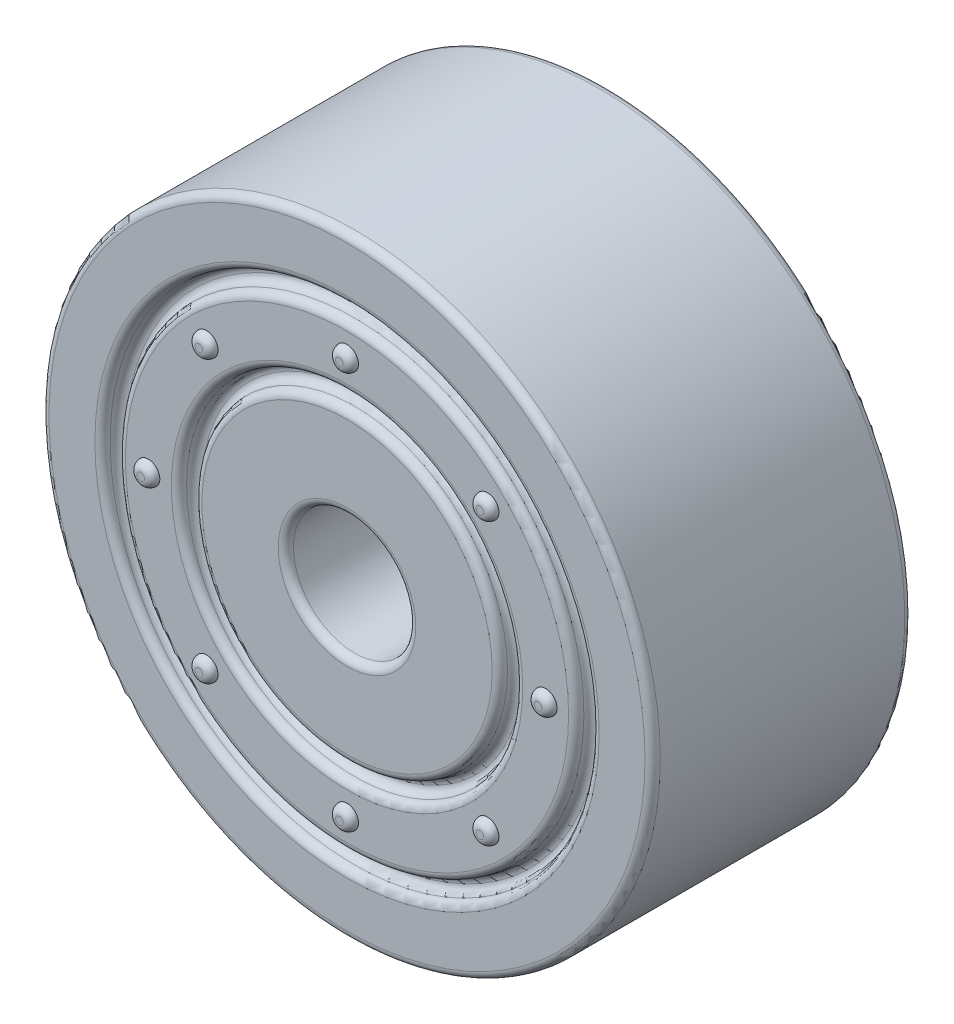
ISO-10303-21;
HEADER;
FILE_DESCRIPTION(('STEP AP214'),'2;1');
FILE_NAME('part.step','',(''),(''),'','','');
FILE_SCHEMA(('AUTOMOTIVE_DESIGN { 1 0 10303 214 1 1 1 1 }'));
ENDSEC;
DATA;
#1=APPLICATION_CONTEXT('core data for automotive mechanical design processes');
#2=APPLICATION_PROTOCOL_DEFINITION('international standard','automotive_design',2000,#1);
#3=PRODUCT_CONTEXT('',#1,'mechanical');
#4=PRODUCT('Part','Part','',(#3));
#5=PRODUCT_RELATED_PRODUCT_CATEGORY('part','',(#4));
#6=PRODUCT_DEFINITION_FORMATION('','',#4);
#7=PRODUCT_DEFINITION_CONTEXT('part definition',#1,'design');
#8=PRODUCT_DEFINITION('design','',#6,#7);
#9=PRODUCT_DEFINITION_SHAPE('','',#8);
#10=(LENGTH_UNIT() NAMED_UNIT(*) SI_UNIT(.MILLI.,.METRE.));
#11=(NAMED_UNIT(*) PLANE_ANGLE_UNIT() SI_UNIT($,.RADIAN.));
#12=(NAMED_UNIT(*) SI_UNIT($,.STERADIAN.) SOLID_ANGLE_UNIT());
#13=UNCERTAINTY_MEASURE_WITH_UNIT(LENGTH_MEASURE(1.E-05),#10,'distance_accuracy_value','');
#14=(GEOMETRIC_REPRESENTATION_CONTEXT(3) GLOBAL_UNCERTAINTY_ASSIGNED_CONTEXT((#13)) GLOBAL_UNIT_ASSIGNED_CONTEXT((#10,
#11,#12)) REPRESENTATION_CONTEXT('',''));
#15=CARTESIAN_POINT('',(0.,0.,0.));
#16=DIRECTION('',(0.,0.,1.));
#17=DIRECTION('',(1.,0.,0.));
#18=AXIS2_PLACEMENT_3D('',#15,#16,#17);
#19=CARTESIAN_POINT('',(0.,0.,17.));
#20=DIRECTION('',(0.,0.,1.));
#21=DIRECTION('',(1.,0.,0.));
#22=AXIS2_PLACEMENT_3D('',#19,#20,#21);
#23=PLANE('',#22);
#24=CARTESIAN_POINT('',(0.,0.,17.));
#25=DIRECTION('',(0.,0.,1.));
#26=DIRECTION('',(1.,0.,0.));
#27=AXIS2_PLACEMENT_3D('',#24,#25,#26);
#28=CIRCLE('',#27,4.5);
#29=CARTESIAN_POINT('',(4.5,0.,17.));
#30=VERTEX_POINT('',#29);
#31=EDGE_CURVE('E62',#30,#30,#28,.F.);
#32=ORIENTED_EDGE('',*,*,#31,.T.);
#33=EDGE_LOOP('',(#32));
#34=FACE_BOUND('',#33,.T.);
#35=CARTESIAN_POINT('',(0.,0.,17.));
#36=DIRECTION('',(0.,0.,1.));
#37=DIRECTION('',(1.,0.,0.));
#38=AXIS2_PLACEMENT_3D('',#35,#36,#37);
#39=CIRCLE('',#38,9.5);
#40=CARTESIAN_POINT('',(9.5,0.,17.));
#41=VERTEX_POINT('',#40);
#42=EDGE_CURVE('E86',#41,#41,#39,.T.);
#43=ORIENTED_EDGE('',*,*,#42,.T.);
#44=EDGE_LOOP('',(#43));
#45=FACE_BOUND('',#44,.T.);
#46=ADVANCED_FACE('F30',(#34,#45),#23,.T.);
#47=CARTESIAN_POINT('',(-9.19238815542496,9.19238815542473,17.));
#48=DIRECTION('',(0.,0.,1.));
#49=DIRECTION('',(1.,0.,0.));
#50=AXIS2_PLACEMENT_3D('',#47,#48,#49);
#51=CIRCLE('',#50,0.750000000000423);
#52=CARTESIAN_POINT('',(-8.44238815542453,9.19238815542473,17.));
#53=VERTEX_POINT('',#52);
#54=EDGE_CURVE('E137',#53,#53,#51,.T.);
#55=ORIENTED_EDGE('',*,*,#54,.F.);
#56=EDGE_LOOP('',(#55));
#57=FACE_BOUND('',#56,.T.);
#58=CARTESIAN_POINT('',(-12.9999999999994,-5.54223333892878E-13,17.));
#59=DIRECTION('',(0.,0.,1.));
#60=DIRECTION('',(1.,0.,0.));
#61=AXIS2_PLACEMENT_3D('',#58,#59,#60);
#62=CIRCLE('',#61,0.750000000000821);
#63=CARTESIAN_POINT('',(-12.2499999999986,-5.54223333892878E-13,17.));
#64=VERTEX_POINT('',#63);
#65=EDGE_CURVE('E134',#64,#64,#62,.T.);
#66=ORIENTED_EDGE('',*,*,#65,.F.);
#67=EDGE_LOOP('',(#66));
#68=FACE_BOUND('',#67,.T.);
#69=CARTESIAN_POINT('',(-9.19238815542418,-9.19238815542551,17.));
#70=DIRECTION('',(0.,0.,1.));
#71=DIRECTION('',(1.,0.,0.));
#72=AXIS2_PLACEMENT_3D('',#69,#70,#71);
#73=CIRCLE('',#72,0.750000000001129);
#74=CARTESIAN_POINT('',(-8.44238815542305,-9.19238815542551,17.));
#75=VERTEX_POINT('',#74);
#76=EDGE_CURVE('E131',#75,#75,#73,.T.);
#77=ORIENTED_EDGE('',*,*,#76,.F.);
#78=EDGE_LOOP('',(#77));
#79=FACE_BOUND('',#78,.T.);
#80=CARTESIAN_POINT('',(1.10526258610797E-12,-13.,17.));
#81=DIRECTION('',(0.,0.,1.));
#82=DIRECTION('',(1.,0.,0.));
#83=AXIS2_PLACEMENT_3D('',#80,#81,#82);
#84=CIRCLE('',#83,0.750000000001144);
#85=CARTESIAN_POINT('',(0.750000000002249,-13.,17.));
#86=VERTEX_POINT('',#85);
#87=EDGE_CURVE('E128',#86,#86,#84,.T.);
#88=ORIENTED_EDGE('',*,*,#87,.F.);
#89=EDGE_LOOP('',(#88));
#90=FACE_BOUND('',#89,.T.);
#91=CARTESIAN_POINT('',(9.19238815542606,-9.19238815542473,17.));
#92=DIRECTION('',(0.,0.,1.));
#93=DIRECTION('',(1.,0.,0.));
#94=AXIS2_PLACEMENT_3D('',#91,#92,#93);
#95=CIRCLE('',#94,0.750000000000857);
#96=CARTESIAN_POINT('',(9.94238815542692,-9.19238815542473,17.));
#97=VERTEX_POINT('',#96);
#98=EDGE_CURVE('E125',#97,#97,#95,.T.);
#99=ORIENTED_EDGE('',*,*,#98,.F.);
#100=EDGE_LOOP('',(#99));
#101=FACE_BOUND('',#100,.T.);
#102=CARTESIAN_POINT('',(13.0000000000006,5.52631293053987E-13,17.));
#103=DIRECTION('',(0.,0.,1.));
#104=DIRECTION('',(1.,0.,0.));
#105=AXIS2_PLACEMENT_3D('',#102,#103,#104);
#106=CIRCLE('',#105,0.750000000000411);
#107=CARTESIAN_POINT('',(13.750000000001,5.52631293053987E-13,17.));
#108=VERTEX_POINT('',#107);
#109=EDGE_CURVE('E122',#108,#108,#106,.T.);
#110=ORIENTED_EDGE('',*,*,#109,.F.);
#111=EDGE_LOOP('',(#110));
#112=FACE_BOUND('',#111,.T.);
#113=CARTESIAN_POINT('',(9.19238815542528,9.19238815542551,17.));
#114=DIRECTION('',(0.,0.,1.));
#115=DIRECTION('',(1.,0.,0.));
#116=AXIS2_PLACEMENT_3D('',#113,#114,#115);
#117=CIRCLE('',#116,0.750000000000065);
#118=CARTESIAN_POINT('',(9.94238815542534,9.19238815542551,17.));
#119=VERTEX_POINT('',#118);
#120=EDGE_CURVE('E119',#119,#119,#117,.T.);
#121=ORIENTED_EDGE('',*,*,#120,.F.);
#122=EDGE_LOOP('',(#121));
#123=FACE_BOUND('',#122,.T.);
#124=CARTESIAN_POINT('',(0.,13.,17.));
#125=DIRECTION('',(0.,0.,1.));
#126=DIRECTION('',(1.,0.,0.));
#127=AXIS2_PLACEMENT_3D('',#124,#125,#126);
#128=CIRCLE('',#127,0.75);
#129=CARTESIAN_POINT('',(0.75,13.,17.));
#130=VERTEX_POINT('',#129);
#131=EDGE_CURVE('E97',#130,#130,#128,.T.);
#132=ORIENTED_EDGE('',*,*,#131,.F.);
#133=EDGE_LOOP('',(#132));
#134=FACE_BOUND('',#133,.T.);
#135=CARTESIAN_POINT('',(0.,0.,17.));
#136=DIRECTION('',(0.,0.,1.));
#137=DIRECTION('',(1.,0.,0.));
#138=AXIS2_PLACEMENT_3D('',#135,#136,#137);
#139=CIRCLE('',#138,11.5);
#140=CARTESIAN_POINT('',(11.5,0.,17.));
#141=VERTEX_POINT('',#140);
#142=EDGE_CURVE('E100',#141,#141,#139,.F.);
#143=ORIENTED_EDGE('',*,*,#142,.T.);
#144=EDGE_LOOP('',(#143));
#145=FACE_BOUND('',#144,.T.);
#146=CARTESIAN_POINT('',(0.,0.,17.));
#147=DIRECTION('',(0.,0.,1.));
#148=DIRECTION('',(1.,0.,0.));
#149=AXIS2_PLACEMENT_3D('',#146,#147,#148);
#150=CIRCLE('',#149,14.4999999999999);
#151=CARTESIAN_POINT('',(14.4999999999999,0.,17.));
#152=VERTEX_POINT('',#151);
#153=EDGE_CURVE('E103',#152,#152,#150,.T.);
#154=ORIENTED_EDGE('',*,*,#153,.T.);
#155=EDGE_LOOP('',(#154));
#156=FACE_BOUND('',#155,.T.);
#157=ADVANCED_FACE('F144',(#57,#68,#79,#90,#101,#112,#123,#134,#145,#156),#23,.T.);
#158=CARTESIAN_POINT('',(0.,0.,17.));
#159=DIRECTION('',(0.,0.,1.));
#160=DIRECTION('',(1.,0.,0.));
#161=AXIS2_PLACEMENT_3D('',#158,#159,#160);
#162=CIRCLE('',#161,19.5);
#163=CARTESIAN_POINT('',(19.5,0.,17.));
#164=VERTEX_POINT('',#163);
#165=EDGE_CURVE('E74',#164,#164,#162,.T.);
#166=ORIENTED_EDGE('',*,*,#165,.T.);
#167=EDGE_LOOP('',(#166));
#168=FACE_BOUND('',#167,.T.);
#169=CARTESIAN_POINT('',(0.,0.,17.));
#170=DIRECTION('',(0.,0.,1.));
#171=DIRECTION('',(1.,0.,0.));
#172=AXIS2_PLACEMENT_3D('',#169,#170,#171);
#173=CIRCLE('',#172,16.5);
#174=CARTESIAN_POINT('',(16.5,0.,17.));
#175=VERTEX_POINT('',#174);
#176=EDGE_CURVE('E106',#175,#175,#173,.F.);
#177=ORIENTED_EDGE('',*,*,#176,.T.);
#178=EDGE_LOOP('',(#177));
#179=FACE_BOUND('',#178,.T.);
#180=ADVANCED_FACE('F147',(#168,#179),#23,.T.);
#181=CARTESIAN_POINT('',(0.,0.,0.));
#182=DIRECTION('',(0.,0.,1.));
#183=DIRECTION('',(1.,0.,0.));
#184=AXIS2_PLACEMENT_3D('',#181,#182,#183);
#185=PLANE('',#184);
#186=CARTESIAN_POINT('',(0.,0.,0.));
#187=DIRECTION('',(0.,0.,1.));
#188=DIRECTION('',(1.,0.,0.));
#189=AXIS2_PLACEMENT_3D('',#186,#187,#188);
#190=CIRCLE('',#189,4.5);
#191=CARTESIAN_POINT('',(4.5,0.,0.));
#192=VERTEX_POINT('',#191);
#193=EDGE_CURVE('E71',#192,#192,#190,.T.);
#194=ORIENTED_EDGE('',*,*,#193,.T.);
#195=EDGE_LOOP('',(#194));
#196=FACE_BOUND('',#195,.T.);
#197=CARTESIAN_POINT('',(0.,0.,0.));
#198=DIRECTION('',(0.,0.,1.));
#199=DIRECTION('',(1.,0.,0.));
#200=AXIS2_PLACEMENT_3D('',#197,#198,#199);
#201=CIRCLE('',#200,19.5);
#202=CARTESIAN_POINT('',(19.5,0.,0.));
#203=VERTEX_POINT('',#202);
#204=EDGE_CURVE('E77',#203,#203,#201,.F.);
#205=ORIENTED_EDGE('',*,*,#204,.T.);
#206=EDGE_LOOP('',(#205));
#207=FACE_BOUND('',#206,.T.);
#208=ADVANCED_FACE('F192',(#196,#207),#185,.F.);
#209=CARTESIAN_POINT('',(0.,0.,17.));
#210=DIRECTION('',(0.,0.,-1.));
#211=DIRECTION('',(-1.,0.,0.));
#212=AXIS2_PLACEMENT_3D('',#209,#210,#211);
#213=CYLINDRICAL_SURFACE('',#212,20.);
#214=CARTESIAN_POINT('',(0.,0.,0.5));
#215=DIRECTION('',(0.,0.,1.));
#216=DIRECTION('',(1.,0.,0.));
#217=AXIS2_PLACEMENT_3D('',#214,#215,#216);
#218=CIRCLE('',#217,20.);
#219=CARTESIAN_POINT('',(20.,0.,0.5));
#220=VERTEX_POINT('',#219);
#221=EDGE_CURVE('E80',#220,#220,#218,.T.);
#222=ORIENTED_EDGE('',*,*,#221,.T.);
#223=EDGE_LOOP('',(#222));
#224=FACE_BOUND('',#223,.T.);
#225=CARTESIAN_POINT('',(0.,0.,16.5));
#226=DIRECTION('',(0.,0.,1.));
#227=DIRECTION('',(1.,0.,0.));
#228=AXIS2_PLACEMENT_3D('',#225,#226,#227);
#229=CIRCLE('',#228,20.);
#230=CARTESIAN_POINT('',(20.,0.,16.5));
#231=VERTEX_POINT('',#230);
#232=EDGE_CURVE('E83',#231,#231,#229,.F.);
#233=ORIENTED_EDGE('',*,*,#232,.T.);
#234=EDGE_LOOP('',(#233));
#235=FACE_BOUND('',#234,.T.);
#236=ADVANCED_FACE('F197',(#224,#235),#213,.T.);
#237=CARTESIAN_POINT('',(0.,0.,17.));
#238=DIRECTION('',(0.,0.,-1.));
#239=DIRECTION('',(-1.,0.,0.));
#240=AXIS2_PLACEMENT_3D('',#237,#238,#239);
#241=CYLINDRICAL_SURFACE('',#240,4.);
#242=CARTESIAN_POINT('',(0.,0.,0.5));
#243=DIRECTION('',(0.,0.,1.));
#244=DIRECTION('',(1.,0.,0.));
#245=AXIS2_PLACEMENT_3D('',#242,#243,#244);
#246=CIRCLE('',#245,4.);
#247=CARTESIAN_POINT('',(4.,0.,0.5));
#248=VERTEX_POINT('',#247);
#249=EDGE_CURVE('E65',#248,#248,#246,.F.);
#250=ORIENTED_EDGE('',*,*,#249,.T.);
#251=EDGE_LOOP('',(#250));
#252=FACE_BOUND('',#251,.T.);
#253=CARTESIAN_POINT('',(0.,0.,16.5));
#254=DIRECTION('',(0.,0.,1.));
#255=DIRECTION('',(1.,0.,0.));
#256=AXIS2_PLACEMENT_3D('',#253,#254,#255);
#257=CIRCLE('',#256,4.);
#258=CARTESIAN_POINT('',(4.,0.,16.5));
#259=VERTEX_POINT('',#258);
#260=EDGE_CURVE('E68',#259,#259,#257,.T.);
#261=ORIENTED_EDGE('',*,*,#260,.T.);
#262=EDGE_LOOP('',(#261));
#263=FACE_BOUND('',#262,.T.);
#264=ADVANCED_FACE('F208',(#252,#263),#241,.F.);
#265=CARTESIAN_POINT('',(0.,0.,16.5));
#266=DIRECTION('',(0.,0.,1.));
#267=DIRECTION('',(1.,0.,0.));
#268=AXIS2_PLACEMENT_3D('',#265,#266,#267);
#269=TOROIDAL_SURFACE('',#268,15.5,0.5);
#270=CARTESIAN_POINT('',(0.,0.,16.5));
#271=DIRECTION('',(0.,0.,1.));
#272=DIRECTION('',(1.,0.,0.));
#273=AXIS2_PLACEMENT_3D('',#270,#271,#272);
#274=CIRCLE('',#273,16.);
#275=CARTESIAN_POINT('',(16.,0.,16.5));
#276=VERTEX_POINT('',#275);
#277=EDGE_CURVE('E109',#276,#276,#274,.F.);
#278=ORIENTED_EDGE('',*,*,#277,.F.);
#279=EDGE_LOOP('',(#278));
#280=FACE_BOUND('',#279,.T.);
#281=CARTESIAN_POINT('',(0.,0.,16.));
#282=DIRECTION('',(0.,0.,1.));
#283=DIRECTION('',(1.,0.,0.));
#284=AXIS2_PLACEMENT_3D('',#281,#282,#283);
#285=CIRCLE('',#284,15.5);
#286=CARTESIAN_POINT('',(15.5,0.,16.));
#287=VERTEX_POINT('',#286);
#288=EDGE_CURVE('E90',#287,#287,#285,.T.);
#289=ORIENTED_EDGE('',*,*,#288,.F.);
#290=EDGE_LOOP('',(#289));
#291=FACE_BOUND('',#290,.T.);
#292=ADVANCED_FACE('F205',(#280,#291),#269,.F.);
#293=CARTESIAN_POINT('',(0.,0.,16.5));
#294=DIRECTION('',(0.,0.,1.));
#295=DIRECTION('',(1.,0.,0.));
#296=AXIS2_PLACEMENT_3D('',#293,#294,#295);
#297=TOROIDAL_SURFACE('',#296,15.4999999999999,0.5);
#298=ORIENTED_EDGE('',*,*,#288,.T.);
#299=EDGE_LOOP('',(#298));
#300=FACE_BOUND('',#299,.T.);
#301=CARTESIAN_POINT('',(0.,0.,16.5));
#302=DIRECTION('',(0.,0.,1.));
#303=DIRECTION('',(1.,0.,0.));
#304=AXIS2_PLACEMENT_3D('',#301,#302,#303);
#305=CIRCLE('',#304,14.9999999999999);
#306=CARTESIAN_POINT('',(14.9999999999999,0.,16.5));
#307=VERTEX_POINT('',#306);
#308=EDGE_CURVE('E112',#307,#307,#305,.T.);
#309=ORIENTED_EDGE('',*,*,#308,.F.);
#310=EDGE_LOOP('',(#309));
#311=FACE_BOUND('',#310,.T.);
#312=ADVANCED_FACE('F180',(#300,#311),#297,.F.);
#313=CARTESIAN_POINT('',(0.,0.,16.5));
#314=DIRECTION('',(0.,0.,1.));
#315=DIRECTION('',(1.,0.,0.));
#316=AXIS2_PLACEMENT_3D('',#313,#314,#315);
#317=TOROIDAL_SURFACE('',#316,16.5,0.5);
#318=ORIENTED_EDGE('',*,*,#176,.F.);
#319=EDGE_LOOP('',(#318));
#320=FACE_BOUND('',#319,.T.);
#321=ORIENTED_EDGE('',*,*,#277,.T.);
#322=EDGE_LOOP('',(#321));
#323=FACE_BOUND('',#322,.T.);
#324=ADVANCED_FACE('F170',(#320,#323),#317,.T.);
#325=CARTESIAN_POINT('',(0.,0.,16.5));
#326=DIRECTION('',(0.,0.,1.));
#327=DIRECTION('',(1.,0.,0.));
#328=AXIS2_PLACEMENT_3D('',#325,#326,#327);
#329=TOROIDAL_SURFACE('',#328,14.4999999999999,0.5);
#330=ORIENTED_EDGE('',*,*,#308,.T.);
#331=EDGE_LOOP('',(#330));
#332=FACE_BOUND('',#331,.T.);
#333=ORIENTED_EDGE('',*,*,#153,.F.);
#334=EDGE_LOOP('',(#333));
#335=FACE_BOUND('',#334,.T.);
#336=ADVANCED_FACE('F167',(#332,#335),#329,.T.);
#337=CARTESIAN_POINT('',(0.,0.,16.5));
#338=DIRECTION('',(0.,0.,1.));
#339=DIRECTION('',(1.,0.,0.));
#340=AXIS2_PLACEMENT_3D('',#337,#338,#339);
#341=TOROIDAL_SURFACE('',#340,11.5,0.5);
#342=ORIENTED_EDGE('',*,*,#142,.F.);
#343=EDGE_LOOP('',(#342));
#344=FACE_BOUND('',#343,.T.);
#345=CARTESIAN_POINT('',(0.,0.,16.5));
#346=DIRECTION('',(0.,0.,1.));
#347=DIRECTION('',(1.,0.,0.));
#348=AXIS2_PLACEMENT_3D('',#345,#346,#347);
#349=CIRCLE('',#348,11.);
#350=CARTESIAN_POINT('',(11.,0.,16.5));
#351=VERTEX_POINT('',#350);
#352=EDGE_CURVE('E87',#351,#351,#349,.T.);
#353=ORIENTED_EDGE('',*,*,#352,.F.);
#354=EDGE_LOOP('',(#353));
#355=FACE_BOUND('',#354,.T.);
#356=ADVANCED_FACE('F169',(#344,#355),#341,.T.);
#357=CARTESIAN_POINT('',(0.,0.,16.5));
#358=DIRECTION('',(0.,0.,1.));
#359=DIRECTION('',(1.,0.,0.));
#360=AXIS2_PLACEMENT_3D('',#357,#358,#359);
#361=TOROIDAL_SURFACE('',#360,10.5,0.5);
#362=ORIENTED_EDGE('',*,*,#352,.T.);
#363=EDGE_LOOP('',(#362));
#364=FACE_BOUND('',#363,.T.);
#365=CARTESIAN_POINT('',(0.,0.,16.));
#366=DIRECTION('',(0.,0.,1.));
#367=DIRECTION('',(1.,0.,0.));
#368=AXIS2_PLACEMENT_3D('',#365,#366,#367);
#369=CIRCLE('',#368,10.5);
#370=CARTESIAN_POINT('',(10.5,0.,16.));
#371=VERTEX_POINT('',#370);
#372=EDGE_CURVE('E91',#371,#371,#369,.T.);
#373=ORIENTED_EDGE('',*,*,#372,.F.);
#374=EDGE_LOOP('',(#373));
#375=FACE_BOUND('',#374,.T.);
#376=ADVANCED_FACE('F177',(#364,#375),#361,.F.);
#377=CARTESIAN_POINT('',(0.,0.,16.5));
#378=DIRECTION('',(0.,0.,1.));
#379=DIRECTION('',(1.,0.,0.));
#380=AXIS2_PLACEMENT_3D('',#377,#378,#379);
#381=TOROIDAL_SURFACE('',#380,9.5,0.5);
#382=ORIENTED_EDGE('',*,*,#42,.F.);
#383=EDGE_LOOP('',(#382));
#384=FACE_BOUND('',#383,.T.);
#385=CARTESIAN_POINT('',(0.,0.,16.5));
#386=DIRECTION('',(0.,0.,1.));
#387=DIRECTION('',(1.,0.,0.));
#388=AXIS2_PLACEMENT_3D('',#385,#386,#387);
#389=CIRCLE('',#388,10.);
#390=CARTESIAN_POINT('',(10.,0.,16.5));
#391=VERTEX_POINT('',#390);
#392=EDGE_CURVE('E94',#391,#391,#389,.F.);
#393=ORIENTED_EDGE('',*,*,#392,.F.);
#394=EDGE_LOOP('',(#393));
#395=FACE_BOUND('',#394,.T.);
#396=ADVANCED_FACE('F463',(#384,#395),#381,.T.);
#397=CARTESIAN_POINT('',(0.,0.,16.5));
#398=DIRECTION('',(0.,0.,1.));
#399=DIRECTION('',(1.,0.,0.));
#400=AXIS2_PLACEMENT_3D('',#397,#398,#399);
#401=TOROIDAL_SURFACE('',#400,10.5,0.5);
#402=ORIENTED_EDGE('',*,*,#372,.T.);
#403=EDGE_LOOP('',(#402));
#404=FACE_BOUND('',#403,.T.);
#405=ORIENTED_EDGE('',*,*,#392,.T.);
#406=EDGE_LOOP('',(#405));
#407=FACE_BOUND('',#406,.T.);
#408=ADVANCED_FACE('F242',(#404,#407),#401,.F.);
#409=CARTESIAN_POINT('',(0.,0.,0.5));
#410=DIRECTION('',(0.,0.,1.));
#411=DIRECTION('',(1.,0.,0.));
#412=AXIS2_PLACEMENT_3D('',#409,#410,#411);
#413=TOROIDAL_SURFACE('',#412,19.5,0.5);
#414=ORIENTED_EDGE('',*,*,#204,.F.);
#415=EDGE_LOOP('',(#414));
#416=FACE_BOUND('',#415,.T.);
#417=ORIENTED_EDGE('',*,*,#221,.F.);
#418=EDGE_LOOP('',(#417));
#419=FACE_BOUND('',#418,.T.);
#420=ADVANCED_FACE('F233',(#416,#419),#413,.T.);
#421=CARTESIAN_POINT('',(0.,0.,16.5));
#422=DIRECTION('',(0.,0.,1.));
#423=DIRECTION('',(1.,0.,0.));
#424=AXIS2_PLACEMENT_3D('',#421,#422,#423);
#425=TOROIDAL_SURFACE('',#424,19.5,0.5);
#426=ORIENTED_EDGE('',*,*,#232,.F.);
#427=EDGE_LOOP('',(#426));
#428=FACE_BOUND('',#427,.T.);
#429=ORIENTED_EDGE('',*,*,#165,.F.);
#430=EDGE_LOOP('',(#429));
#431=FACE_BOUND('',#430,.T.);
#432=ADVANCED_FACE('F229',(#428,#431),#425,.T.);
#433=CARTESIAN_POINT('',(0.,13.,17.5));
#434=DIRECTION('',(0.,0.,1.));
#435=DIRECTION('',(1.,0.,0.));
#436=AXIS2_PLACEMENT_3D('',#433,#434,#435);
#437=PLANE('',#436);
#438=CARTESIAN_POINT('',(0.,13.,17.5));
#439=DIRECTION('',(0.,0.,1.));
#440=DIRECTION('',(1.,0.,0.));
#441=AXIS2_PLACEMENT_3D('',#438,#439,#440);
#442=CIRCLE('',#441,0.25);
#443=CARTESIAN_POINT('',(0.25,13.,17.5));
#444=VERTEX_POINT('',#443);
#445=EDGE_CURVE('E45',#444,#444,#442,.T.);
#446=ORIENTED_EDGE('',*,*,#445,.T.);
#447=EDGE_LOOP('',(#446));
#448=FACE_BOUND('',#447,.T.);
#449=ADVANCED_FACE('F232',(#448),#437,.T.);
#450=CARTESIAN_POINT('',(9.19238815542528,9.19238815542551,17.5));
#451=DIRECTION('',(0.,0.,1.));
#452=DIRECTION('',(1.,0.,0.));
#453=AXIS2_PLACEMENT_3D('',#450,#451,#452);
#454=PLANE('',#453);
#455=CARTESIAN_POINT('',(9.19238815542528,9.19238815542551,17.5));
#456=DIRECTION('',(0.,0.,1.));
#457=DIRECTION('',(1.,0.,0.));
#458=AXIS2_PLACEMENT_3D('',#455,#456,#457);
#459=CIRCLE('',#458,0.250000000000065);
#460=CARTESIAN_POINT('',(9.44238815542534,9.19238815542551,17.5));
#461=VERTEX_POINT('',#460);
#462=EDGE_CURVE('E50',#461,#461,#459,.T.);
#463=ORIENTED_EDGE('',*,*,#462,.T.);
#464=EDGE_LOOP('',(#463));
#465=FACE_BOUND('',#464,.T.);
#466=ADVANCED_FACE('F239',(#465),#454,.T.);
#467=CARTESIAN_POINT('',(13.0000000000006,5.52631293053987E-13,17.5));
#468=DIRECTION('',(0.,0.,1.));
#469=DIRECTION('',(1.,0.,0.));
#470=AXIS2_PLACEMENT_3D('',#467,#468,#469);
#471=PLANE('',#470);
#472=CARTESIAN_POINT('',(13.0000000000006,5.52631293053987E-13,17.5));
#473=DIRECTION('',(0.,0.,1.));
#474=DIRECTION('',(1.,0.,0.));
#475=AXIS2_PLACEMENT_3D('',#472,#473,#474);
#476=CIRCLE('',#475,0.250000000000411);
#477=CARTESIAN_POINT('',(13.250000000001,5.52631293053987E-13,17.5));
#478=VERTEX_POINT('',#477);
#479=EDGE_CURVE('E53',#478,#478,#476,.T.);
#480=ORIENTED_EDGE('',*,*,#479,.T.);
#481=EDGE_LOOP('',(#480));
#482=FACE_BOUND('',#481,.T.);
#483=ADVANCED_FACE('F352',(#482),#471,.T.);
#484=CARTESIAN_POINT('',(9.19238815542606,-9.19238815542473,17.5));
#485=DIRECTION('',(0.,0.,1.));
#486=DIRECTION('',(1.,0.,0.));
#487=AXIS2_PLACEMENT_3D('',#484,#485,#486);
#488=PLANE('',#487);
#489=CARTESIAN_POINT('',(9.19238815542606,-9.19238815542473,17.5));
#490=DIRECTION('',(0.,0.,1.));
#491=DIRECTION('',(1.,0.,0.));
#492=AXIS2_PLACEMENT_3D('',#489,#490,#491);
#493=CIRCLE('',#492,0.250000000000857);
#494=CARTESIAN_POINT('',(9.44238815542692,-9.19238815542473,17.5));
#495=VERTEX_POINT('',#494);
#496=EDGE_CURVE('E59',#495,#495,#493,.T.);
#497=ORIENTED_EDGE('',*,*,#496,.T.);
#498=EDGE_LOOP('',(#497));
#499=FACE_BOUND('',#498,.T.);
#500=ADVANCED_FACE('F357',(#499),#488,.T.);
#501=CARTESIAN_POINT('',(1.10526258610797E-12,-13.,17.5));
#502=DIRECTION('',(0.,0.,1.));
#503=DIRECTION('',(1.,0.,0.));
#504=AXIS2_PLACEMENT_3D('',#501,#502,#503);
#505=PLANE('',#504);
#506=CARTESIAN_POINT('',(1.10526258610797E-12,-13.,17.5));
#507=DIRECTION('',(0.,0.,1.));
#508=DIRECTION('',(1.,0.,0.));
#509=AXIS2_PLACEMENT_3D('',#506,#507,#508);
#510=CIRCLE('',#509,0.250000000001144);
#511=CARTESIAN_POINT('',(0.250000000002249,-13.,17.5));
#512=VERTEX_POINT('',#511);
#513=EDGE_CURVE('E56',#512,#512,#510,.T.);
#514=ORIENTED_EDGE('',*,*,#513,.T.);
#515=EDGE_LOOP('',(#514));
#516=FACE_BOUND('',#515,.T.);
#517=ADVANCED_FACE('F345',(#516),#505,.T.);
#518=CARTESIAN_POINT('',(-9.19238815542418,-9.19238815542551,17.5));
#519=DIRECTION('',(0.,0.,1.));
#520=DIRECTION('',(1.,0.,0.));
#521=AXIS2_PLACEMENT_3D('',#518,#519,#520);
#522=PLANE('',#521);
#523=CARTESIAN_POINT('',(-9.19238815542418,-9.19238815542551,17.5));
#524=DIRECTION('',(0.,0.,1.));
#525=DIRECTION('',(1.,0.,0.));
#526=AXIS2_PLACEMENT_3D('',#523,#524,#525);
#527=CIRCLE('',#526,0.250000000001129);
#528=CARTESIAN_POINT('',(-8.94238815542305,-9.19238815542551,17.5));
#529=VERTEX_POINT('',#528);
#530=EDGE_CURVE('E10',#529,#529,#527,.T.);
#531=ORIENTED_EDGE('',*,*,#530,.T.);
#532=EDGE_LOOP('',(#531));
#533=FACE_BOUND('',#532,.T.);
#534=ADVANCED_FACE('F336',(#533),#522,.T.);
#535=CARTESIAN_POINT('',(-12.9999999999994,-5.54223333892878E-13,17.5));
#536=DIRECTION('',(0.,0.,1.));
#537=DIRECTION('',(1.,0.,0.));
#538=AXIS2_PLACEMENT_3D('',#535,#536,#537);
#539=PLANE('',#538);
#540=CARTESIAN_POINT('',(-12.9999999999994,-5.54223333892878E-13,17.5));
#541=DIRECTION('',(0.,0.,1.));
#542=DIRECTION('',(1.,0.,0.));
#543=AXIS2_PLACEMENT_3D('',#540,#541,#542);
#544=CIRCLE('',#543,0.250000000000821);
#545=CARTESIAN_POINT('',(-12.7499999999986,-5.54223333892878E-13,17.5));
#546=VERTEX_POINT('',#545);
#547=EDGE_CURVE('E37',#546,#546,#544,.T.);
#548=ORIENTED_EDGE('',*,*,#547,.T.);
#549=EDGE_LOOP('',(#548));
#550=FACE_BOUND('',#549,.T.);
#551=ADVANCED_FACE('F325',(#550),#539,.T.);
#552=CARTESIAN_POINT('',(-9.19238815542496,9.19238815542473,17.5));
#553=DIRECTION('',(0.,0.,1.));
#554=DIRECTION('',(1.,0.,0.));
#555=AXIS2_PLACEMENT_3D('',#552,#553,#554);
#556=PLANE('',#555);
#557=CARTESIAN_POINT('',(-9.19238815542496,9.19238815542473,17.5));
#558=DIRECTION('',(0.,0.,1.));
#559=DIRECTION('',(1.,0.,0.));
#560=AXIS2_PLACEMENT_3D('',#557,#558,#559);
#561=CIRCLE('',#560,0.250000000000423);
#562=CARTESIAN_POINT('',(-8.94238815542453,9.19238815542473,17.5));
#563=VERTEX_POINT('',#562);
#564=EDGE_CURVE('E41',#563,#563,#561,.T.);
#565=ORIENTED_EDGE('',*,*,#564,.T.);
#566=EDGE_LOOP('',(#565));
#567=FACE_BOUND('',#566,.T.);
#568=ADVANCED_FACE('F250',(#567),#556,.T.);
#569=CARTESIAN_POINT('',(0.,0.,0.5));
#570=DIRECTION('',(0.,0.,1.));
#571=DIRECTION('',(1.,0.,0.));
#572=AXIS2_PLACEMENT_3D('',#569,#570,#571);
#573=TOROIDAL_SURFACE('',#572,4.5,0.5);
#574=ORIENTED_EDGE('',*,*,#249,.F.);
#575=EDGE_LOOP('',(#574));
#576=FACE_BOUND('',#575,.T.);
#577=ORIENTED_EDGE('',*,*,#193,.F.);
#578=EDGE_LOOP('',(#577));
#579=FACE_BOUND('',#578,.T.);
#580=ADVANCED_FACE('F246',(#576,#579),#573,.T.);
#581=CARTESIAN_POINT('',(0.,0.,16.5));
#582=DIRECTION('',(0.,0.,1.));
#583=DIRECTION('',(1.,0.,0.));
#584=AXIS2_PLACEMENT_3D('',#581,#582,#583);
#585=TOROIDAL_SURFACE('',#584,4.5,0.5);
#586=ORIENTED_EDGE('',*,*,#31,.F.);
#587=EDGE_LOOP('',(#586));
#588=FACE_BOUND('',#587,.T.);
#589=ORIENTED_EDGE('',*,*,#260,.F.);
#590=EDGE_LOOP('',(#589));
#591=FACE_BOUND('',#590,.T.);
#592=ADVANCED_FACE('F249',(#588,#591),#585,.T.);
#593=CARTESIAN_POINT('',(9.19238815542606,-9.19238815542473,17.));
#594=DIRECTION('',(0.,0.,1.));
#595=DIRECTION('',(1.,0.,0.));
#596=AXIS2_PLACEMENT_3D('',#593,#594,#595);
#597=DEGENERATE_TOROIDAL_SURFACE('',#596,0.250000000000857,0.5,.T.);
#598=ORIENTED_EDGE('',*,*,#98,.T.);
#599=EDGE_LOOP('',(#598));
#600=FACE_BOUND('',#599,.T.);
#601=ORIENTED_EDGE('',*,*,#496,.F.);
#602=EDGE_LOOP('',(#601));
#603=FACE_BOUND('',#602,.T.);
#604=ADVANCED_FACE('F254',(#600,#603),#597,.T.);
#605=CARTESIAN_POINT('',(1.10526258610797E-12,-13.,17.));
#606=DIRECTION('',(0.,0.,1.));
#607=DIRECTION('',(1.,0.,0.));
#608=AXIS2_PLACEMENT_3D('',#605,#606,#607);
#609=DEGENERATE_TOROIDAL_SURFACE('',#608,0.250000000001144,0.5,.T.);
#610=ORIENTED_EDGE('',*,*,#87,.T.);
#611=EDGE_LOOP('',(#610));
#612=FACE_BOUND('',#611,.T.);
#613=ORIENTED_EDGE('',*,*,#513,.F.);
#614=EDGE_LOOP('',(#613));
#615=FACE_BOUND('',#614,.T.);
#616=ADVANCED_FACE('F258',(#612,#615),#609,.T.);
#617=CARTESIAN_POINT('',(13.0000000000006,5.52631293053987E-13,17.));
#618=DIRECTION('',(0.,0.,1.));
#619=DIRECTION('',(1.,0.,0.));
#620=AXIS2_PLACEMENT_3D('',#617,#618,#619);
#621=DEGENERATE_TOROIDAL_SURFACE('',#620,0.250000000000411,0.5,.T.);
#622=ORIENTED_EDGE('',*,*,#109,.T.);
#623=EDGE_LOOP('',(#622));
#624=FACE_BOUND('',#623,.T.);
#625=ORIENTED_EDGE('',*,*,#479,.F.);
#626=EDGE_LOOP('',(#625));
#627=FACE_BOUND('',#626,.T.);
#628=ADVANCED_FACE('F262',(#624,#627),#621,.T.);
#629=CARTESIAN_POINT('',(9.19238815542528,9.19238815542551,17.));
#630=DIRECTION('',(0.,0.,1.));
#631=DIRECTION('',(1.,0.,0.));
#632=AXIS2_PLACEMENT_3D('',#629,#630,#631);
#633=DEGENERATE_TOROIDAL_SURFACE('',#632,0.250000000000065,0.5,.T.);
#634=ORIENTED_EDGE('',*,*,#120,.T.);
#635=EDGE_LOOP('',(#634));
#636=FACE_BOUND('',#635,.T.);
#637=ORIENTED_EDGE('',*,*,#462,.F.);
#638=EDGE_LOOP('',(#637));
#639=FACE_BOUND('',#638,.T.);
#640=ADVANCED_FACE('F266',(#636,#639),#633,.T.);
#641=CARTESIAN_POINT('',(0.,13.,17.));
#642=DIRECTION('',(0.,0.,1.));
#643=DIRECTION('',(1.,0.,0.));
#644=AXIS2_PLACEMENT_3D('',#641,#642,#643);
#645=DEGENERATE_TOROIDAL_SURFACE('',#644,0.25,0.5,.T.);
#646=ORIENTED_EDGE('',*,*,#131,.T.);
#647=EDGE_LOOP('',(#646));
#648=FACE_BOUND('',#647,.T.);
#649=ORIENTED_EDGE('',*,*,#445,.F.);
#650=EDGE_LOOP('',(#649));
#651=FACE_BOUND('',#650,.T.);
#652=ADVANCED_FACE('F270',(#648,#651),#645,.T.);
#653=CARTESIAN_POINT('',(-9.19238815542496,9.19238815542473,17.));
#654=DIRECTION('',(0.,0.,1.));
#655=DIRECTION('',(1.,0.,0.));
#656=AXIS2_PLACEMENT_3D('',#653,#654,#655);
#657=DEGENERATE_TOROIDAL_SURFACE('',#656,0.250000000000423,0.5,.T.);
#658=ORIENTED_EDGE('',*,*,#54,.T.);
#659=EDGE_LOOP('',(#658));
#660=FACE_BOUND('',#659,.T.);
#661=ORIENTED_EDGE('',*,*,#564,.F.);
#662=EDGE_LOOP('',(#661));
#663=FACE_BOUND('',#662,.T.);
#664=ADVANCED_FACE('F141',(#660,#663),#657,.T.);
#665=CARTESIAN_POINT('',(-12.9999999999994,-5.54223333892878E-13,17.));
#666=DIRECTION('',(0.,0.,1.));
#667=DIRECTION('',(1.,0.,0.));
#668=AXIS2_PLACEMENT_3D('',#665,#666,#667);
#669=DEGENERATE_TOROIDAL_SURFACE('',#668,0.250000000000821,0.5,.T.);
#670=ORIENTED_EDGE('',*,*,#65,.T.);
#671=EDGE_LOOP('',(#670));
#672=FACE_BOUND('',#671,.T.);
#673=ORIENTED_EDGE('',*,*,#547,.F.);
#674=EDGE_LOOP('',(#673));
#675=FACE_BOUND('',#674,.T.);
#676=ADVANCED_FACE('F276',(#672,#675),#669,.T.);
#677=CARTESIAN_POINT('',(-9.19238815542418,-9.19238815542551,17.));
#678=DIRECTION('',(0.,0.,1.));
#679=DIRECTION('',(1.,0.,0.));
#680=AXIS2_PLACEMENT_3D('',#677,#678,#679);
#681=DEGENERATE_TOROIDAL_SURFACE('',#680,0.250000000001129,0.5,.T.);
#682=ORIENTED_EDGE('',*,*,#76,.T.);
#683=EDGE_LOOP('',(#682));
#684=FACE_BOUND('',#683,.T.);
#685=ORIENTED_EDGE('',*,*,#530,.F.);
#686=EDGE_LOOP('',(#685));
#687=FACE_BOUND('',#686,.T.);
#688=ADVANCED_FACE('F32',(#684,#687),#681,.T.);
#689=CLOSED_SHELL('',(#46,#157,#180,#208,#236,#264,#292,#312,#324,#336,#356,#376,#396,#408,#420,
#432,#449,#466,#483,#500,#517,#534,#551,#568,#580,#592,#604,#616,#628,#640,#652,#664,#676,#688));
#690=MANIFOLD_SOLID_BREP('B2',#689);
#691=ADVANCED_BREP_SHAPE_REPRESENTATION('',(#18,#690),#14);
#692=SHAPE_DEFINITION_REPRESENTATION(#9,#691);
ENDSEC;
END-ISO-10303-21;
